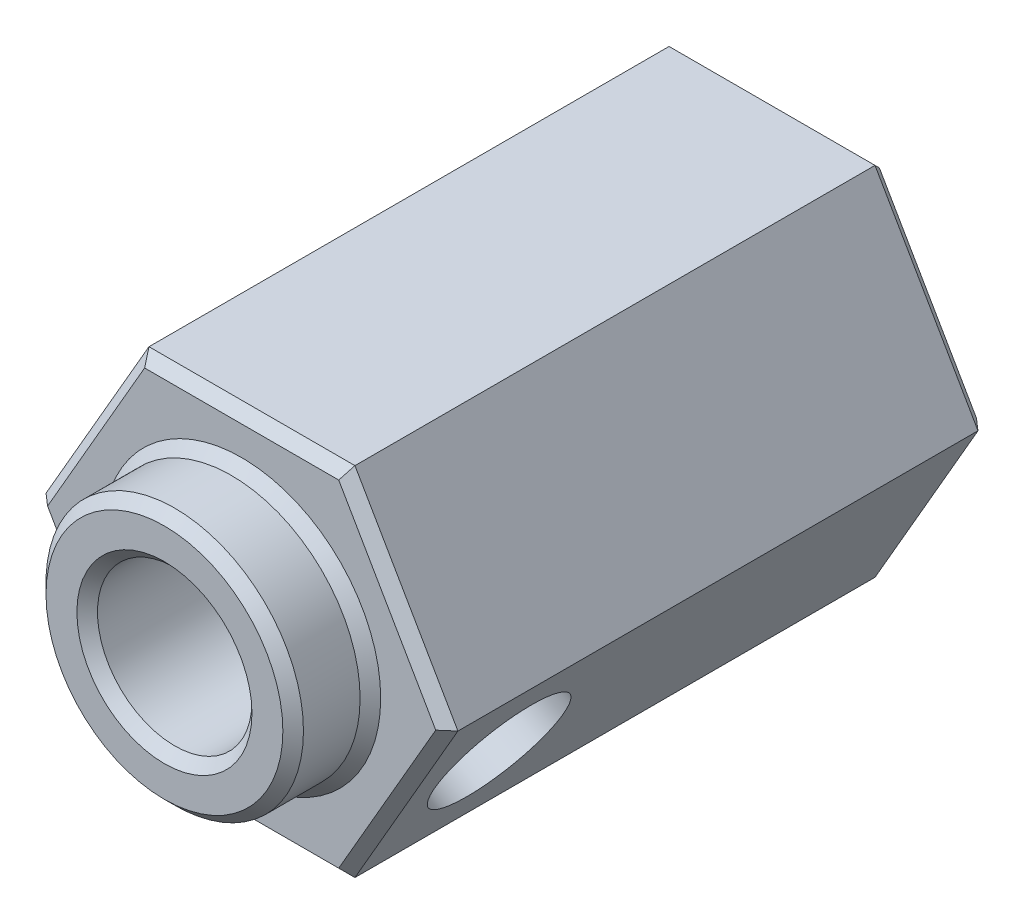
ISO-10303-21;
HEADER;
FILE_DESCRIPTION(('STEP AP214'),'2;1');
FILE_NAME('part.step','',(''),(''),'','','');
FILE_SCHEMA(('AUTOMOTIVE_DESIGN { 1 0 10303 214 1 1 1 1 }'));
ENDSEC;
DATA;
#1=APPLICATION_CONTEXT('core data for automotive mechanical design processes');
#2=APPLICATION_PROTOCOL_DEFINITION('international standard','automotive_design',2000,#1);
#3=PRODUCT_CONTEXT('',#1,'mechanical');
#4=PRODUCT('Part','Part','',(#3));
#5=PRODUCT_RELATED_PRODUCT_CATEGORY('part','',(#4));
#6=PRODUCT_DEFINITION_FORMATION('','',#4);
#7=PRODUCT_DEFINITION_CONTEXT('part definition',#1,'design');
#8=PRODUCT_DEFINITION('design','',#6,#7);
#9=PRODUCT_DEFINITION_SHAPE('','',#8);
#10=(LENGTH_UNIT() NAMED_UNIT(*) SI_UNIT(.MILLI.,.METRE.));
#11=(NAMED_UNIT(*) PLANE_ANGLE_UNIT() SI_UNIT($,.RADIAN.));
#12=(NAMED_UNIT(*) SI_UNIT($,.STERADIAN.) SOLID_ANGLE_UNIT());
#13=UNCERTAINTY_MEASURE_WITH_UNIT(LENGTH_MEASURE(1.E-05),#10,'distance_accuracy_value','');
#14=(GEOMETRIC_REPRESENTATION_CONTEXT(3) GLOBAL_UNCERTAINTY_ASSIGNED_CONTEXT((#13)) GLOBAL_UNIT_ASSIGNED_CONTEXT((#10,
#11,#12)) REPRESENTATION_CONTEXT('',''));
#15=CARTESIAN_POINT('',(0.,0.,0.));
#16=DIRECTION('',(0.,0.,1.));
#17=DIRECTION('',(1.,0.,0.));
#18=AXIS2_PLACEMENT_3D('',#15,#16,#17);
#19=CARTESIAN_POINT('',(-2.,3.46410161513776,12.));
#20=DIRECTION('',(0.866025403784439,-0.5,0.));
#21=DIRECTION('',(0.5,0.866025403784439,0.));
#22=AXIS2_PLACEMENT_3D('',#19,#20,#21);
#23=PLANE('',#22);
#24=DIRECTION('',(0.,0.,-1.));
#25=VECTOR('',#24,1.);
#26=CARTESIAN_POINT('',(-2.,3.46410161513776,12.));
#27=LINE('',#26,#25);
#28=CARTESIAN_POINT('',(-2.,3.46410161513776,10.3));
#29=VERTEX_POINT('',#28);
#30=CARTESIAN_POINT('',(-2.,3.46410161513776,0.199999999999999));
#31=VERTEX_POINT('',#30);
#32=EDGE_CURVE('E256',#29,#31,#27,.T.);
#33=ORIENTED_EDGE('',*,*,#32,.T.);
#34=DIRECTION('',(-0.5,-0.866025403784439,0.));
#35=VECTOR('',#34,1.);
#36=CARTESIAN_POINT('',(-2.,3.46410161513776,0.199999999999999));
#37=LINE('',#36,#35);
#38=CARTESIAN_POINT('',(-4.,0.,0.199999999999999));
#39=VERTEX_POINT('',#38);
#40=EDGE_CURVE('E151',#31,#39,#37,.T.);
#41=ORIENTED_EDGE('',*,*,#40,.T.);
#42=DIRECTION('',(0.,0.,-1.));
#43=VECTOR('',#42,1.);
#44=CARTESIAN_POINT('',(-4.,0.,12.));
#45=LINE('',#44,#43);
#46=CARTESIAN_POINT('',(-4.,0.,10.3));
#47=VERTEX_POINT('',#46);
#48=EDGE_CURVE('E135',#47,#39,#45,.T.);
#49=ORIENTED_EDGE('',*,*,#48,.F.);
#50=DIRECTION('',(0.5,0.866025403784439,0.));
#51=VECTOR('',#50,1.);
#52=CARTESIAN_POINT('',(-2.,3.46410161513776,10.3));
#53=LINE('',#52,#51);
#54=EDGE_CURVE('E148',#47,#29,#53,.T.);
#55=ORIENTED_EDGE('',*,*,#54,.T.);
#56=EDGE_LOOP('',(#33,#41,#49,#55));
#57=FACE_BOUND('',#56,.T.);
#58=ADVANCED_FACE('F39',(#57),#23,.F.);
#59=CARTESIAN_POINT('',(-4.,0.,12.));
#60=DIRECTION('',(0.866025403784438,0.5,0.));
#61=DIRECTION('',(-0.5,0.866025403784439,0.));
#62=AXIS2_PLACEMENT_3D('',#59,#60,#61);
#63=PLANE('',#62);
#64=ORIENTED_EDGE('',*,*,#48,.T.);
#65=DIRECTION('',(0.5,-0.866025403784439,0.));
#66=VECTOR('',#65,1.);
#67=CARTESIAN_POINT('',(-4.,0.,0.199999999999999));
#68=LINE('',#67,#66);
#69=CARTESIAN_POINT('',(-2.,-3.46410161513776,0.199999999999999));
#70=VERTEX_POINT('',#69);
#71=EDGE_CURVE('E143',#39,#70,#68,.T.);
#72=ORIENTED_EDGE('',*,*,#71,.T.);
#73=DIRECTION('',(0.,0.,-1.));
#74=VECTOR('',#73,1.);
#75=CARTESIAN_POINT('',(-2.,-3.46410161513776,12.));
#76=LINE('',#75,#74);
#77=CARTESIAN_POINT('',(-2.,-3.46410161513776,10.3));
#78=VERTEX_POINT('',#77);
#79=EDGE_CURVE('E138',#78,#70,#76,.T.);
#80=ORIENTED_EDGE('',*,*,#79,.F.);
#81=DIRECTION('',(-0.5,0.866025403784439,0.));
#82=VECTOR('',#81,1.);
#83=CARTESIAN_POINT('',(-4.,0.,10.3));
#84=LINE('',#83,#82);
#85=EDGE_CURVE('E131',#78,#47,#84,.T.);
#86=ORIENTED_EDGE('',*,*,#85,.T.);
#87=EDGE_LOOP('',(#64,#72,#80,#86));
#88=FACE_BOUND('',#87,.T.);
#89=ADVANCED_FACE('F133',(#88),#63,.F.);
#90=CARTESIAN_POINT('',(-2.,-3.46410161513776,12.));
#91=DIRECTION('',(0.,1.,0.));
#92=DIRECTION('',(-1.,0.,0.));
#93=AXIS2_PLACEMENT_3D('',#90,#91,#92);
#94=PLANE('',#93);
#95=ORIENTED_EDGE('',*,*,#79,.T.);
#96=DIRECTION('',(1.,0.,0.));
#97=VECTOR('',#96,1.);
#98=CARTESIAN_POINT('',(-2.,-3.46410161513776,0.199999999999999));
#99=LINE('',#98,#97);
#100=CARTESIAN_POINT('',(2.,-3.46410161513776,0.199999999999999));
#101=VERTEX_POINT('',#100);
#102=EDGE_CURVE('E233',#70,#101,#99,.T.);
#103=ORIENTED_EDGE('',*,*,#102,.T.);
#104=DIRECTION('',(0.,0.,-1.));
#105=VECTOR('',#104,1.);
#106=CARTESIAN_POINT('',(2.,-3.46410161513776,12.));
#107=LINE('',#106,#105);
#108=CARTESIAN_POINT('',(2.,-3.46410161513776,10.3));
#109=VERTEX_POINT('',#108);
#110=EDGE_CURVE('E266',#109,#101,#107,.T.);
#111=ORIENTED_EDGE('',*,*,#110,.F.);
#112=DIRECTION('',(-1.,0.,0.));
#113=VECTOR('',#112,1.);
#114=CARTESIAN_POINT('',(-2.,-3.46410161513776,10.3));
#115=LINE('',#114,#113);
#116=EDGE_CURVE('E230',#109,#78,#115,.T.);
#117=ORIENTED_EDGE('',*,*,#116,.T.);
#118=EDGE_LOOP('',(#95,#103,#111,#117));
#119=FACE_BOUND('',#118,.T.);
#120=ADVANCED_FACE('F311',(#119),#94,.F.);
#121=CARTESIAN_POINT('',(2.,-3.46410161513776,12.));
#122=DIRECTION('',(-0.866025403784439,0.5,0.));
#123=DIRECTION('',(-0.5,-0.866025403784439,0.));
#124=AXIS2_PLACEMENT_3D('',#121,#122,#123);
#125=PLANE('',#124);
#126=CARTESIAN_POINT('',(3.,-1.73205080756888,8.5));
#127=DIRECTION('',(0.866025403784439,-0.5,0.));
#128=DIRECTION('',(0.5,0.866025403784439,0.));
#129=AXIS2_PLACEMENT_3D('',#126,#127,#128);
#130=CIRCLE('',#129,1.24999999999999);
#131=CARTESIAN_POINT('',(3.625,-0.64951905283834,8.5));
#132=VERTEX_POINT('',#131);
#133=EDGE_CURVE('E215',#132,#132,#130,.T.);
#134=ORIENTED_EDGE('',*,*,#133,.F.);
#135=EDGE_LOOP('',(#134));
#136=FACE_BOUND('',#135,.T.);
#137=ORIENTED_EDGE('',*,*,#110,.T.);
#138=DIRECTION('',(0.5,0.866025403784439,0.));
#139=VECTOR('',#138,1.);
#140=CARTESIAN_POINT('',(2.,-3.46410161513776,0.199999999999999));
#141=LINE('',#140,#139);
#142=CARTESIAN_POINT('',(4.,0.,0.199999999999999));
#143=VERTEX_POINT('',#142);
#144=EDGE_CURVE('E243',#101,#143,#141,.T.);
#145=ORIENTED_EDGE('',*,*,#144,.T.);
#146=DIRECTION('',(0.,0.,-1.));
#147=VECTOR('',#146,1.);
#148=CARTESIAN_POINT('',(4.,0.,12.));
#149=LINE('',#148,#147);
#150=CARTESIAN_POINT('',(4.,0.,10.3));
#151=VERTEX_POINT('',#150);
#152=EDGE_CURVE('E264',#151,#143,#149,.T.);
#153=ORIENTED_EDGE('',*,*,#152,.F.);
#154=DIRECTION('',(-0.5,-0.866025403784439,0.));
#155=VECTOR('',#154,1.);
#156=CARTESIAN_POINT('',(2.,-3.46410161513776,10.3));
#157=LINE('',#156,#155);
#158=EDGE_CURVE('E225',#151,#109,#157,.T.);
#159=ORIENTED_EDGE('',*,*,#158,.T.);
#160=EDGE_LOOP('',(#137,#145,#153,#159));
#161=FACE_BOUND('',#160,.T.);
#162=ADVANCED_FACE('F382',(#136,#161),#125,.F.);
#163=CARTESIAN_POINT('',(4.,0.,12.));
#164=DIRECTION('',(-0.866025403784438,-0.5,0.));
#165=DIRECTION('',(0.5,-0.866025403784438,0.));
#166=AXIS2_PLACEMENT_3D('',#163,#164,#165);
#167=PLANE('',#166);
#168=ORIENTED_EDGE('',*,*,#152,.T.);
#169=DIRECTION('',(-0.5,0.866025403784438,0.));
#170=VECTOR('',#169,1.);
#171=CARTESIAN_POINT('',(4.,0.,0.199999999999999));
#172=LINE('',#171,#170);
#173=CARTESIAN_POINT('',(2.,3.46410161513776,0.199999999999999));
#174=VERTEX_POINT('',#173);
#175=EDGE_CURVE('E247',#143,#174,#172,.T.);
#176=ORIENTED_EDGE('',*,*,#175,.T.);
#177=DIRECTION('',(0.,0.,-1.));
#178=VECTOR('',#177,1.);
#179=CARTESIAN_POINT('',(2.,3.46410161513776,12.));
#180=LINE('',#179,#178);
#181=CARTESIAN_POINT('',(2.,3.46410161513776,10.3));
#182=VERTEX_POINT('',#181);
#183=EDGE_CURVE('E254',#182,#174,#180,.T.);
#184=ORIENTED_EDGE('',*,*,#183,.F.);
#185=DIRECTION('',(0.5,-0.866025403784438,0.));
#186=VECTOR('',#185,1.);
#187=CARTESIAN_POINT('',(4.,0.,10.3));
#188=LINE('',#187,#186);
#189=EDGE_CURVE('E245',#182,#151,#188,.T.);
#190=ORIENTED_EDGE('',*,*,#189,.T.);
#191=EDGE_LOOP('',(#168,#176,#184,#190));
#192=FACE_BOUND('',#191,.T.);
#193=ADVANCED_FACE('F260',(#192),#167,.F.);
#194=CARTESIAN_POINT('',(2.,3.46410161513776,12.));
#195=DIRECTION('',(0.,-1.,0.));
#196=DIRECTION('',(0.,0.,-1.));
#197=AXIS2_PLACEMENT_3D('',#194,#195,#196);
#198=PLANE('',#197);
#199=ORIENTED_EDGE('',*,*,#183,.T.);
#200=DIRECTION('',(-1.,0.,0.));
#201=VECTOR('',#200,1.);
#202=CARTESIAN_POINT('',(2.,3.46410161513776,0.199999999999999));
#203=LINE('',#202,#201);
#204=EDGE_CURVE('E166',#174,#31,#203,.T.);
#205=ORIENTED_EDGE('',*,*,#204,.T.);
#206=ORIENTED_EDGE('',*,*,#32,.F.);
#207=DIRECTION('',(1.,0.,0.));
#208=VECTOR('',#207,1.);
#209=CARTESIAN_POINT('',(2.,3.46410161513776,10.3));
#210=LINE('',#209,#208);
#211=EDGE_CURVE('E170',#29,#182,#210,.T.);
#212=ORIENTED_EDGE('',*,*,#211,.T.);
#213=EDGE_LOOP('',(#199,#205,#206,#212));
#214=FACE_BOUND('',#213,.T.);
#215=ADVANCED_FACE('F253',(#214),#198,.F.);
#216=CARTESIAN_POINT('',(0.,0.,0.));
#217=DIRECTION('',(0.,0.,1.));
#218=DIRECTION('',(1.,0.,0.));
#219=AXIS2_PLACEMENT_3D('',#216,#217,#218);
#220=PLANE('',#219);
#221=DIRECTION('',(-1.,0.,0.));
#222=VECTOR('',#221,1.);
#223=CARTESIAN_POINT('',(0.,-3.26410161513775,0.));
#224=LINE('',#223,#222);
#225=CARTESIAN_POINT('',(1.88452994616208,-3.26410161513775,0.));
#226=VERTEX_POINT('',#225);
#227=CARTESIAN_POINT('',(-1.88452994616207,-3.26410161513776,0.));
#228=VERTEX_POINT('',#227);
#229=EDGE_CURVE('E238',#226,#228,#224,.T.);
#230=ORIENTED_EDGE('',*,*,#229,.T.);
#231=DIRECTION('',(-0.5,0.866025403784438,0.));
#232=VECTOR('',#231,1.);
#233=CARTESIAN_POINT('',(-2.82679491924311,-1.63205080756888,0.));
#234=LINE('',#233,#232);
#235=CARTESIAN_POINT('',(-3.76905989232415,0.,0.));
#236=VERTEX_POINT('',#235);
#237=EDGE_CURVE('E234',#228,#236,#234,.T.);
#238=ORIENTED_EDGE('',*,*,#237,.T.);
#239=DIRECTION('',(0.5,0.866025403784439,0.));
#240=VECTOR('',#239,1.);
#241=CARTESIAN_POINT('',(-2.82679491924311,1.63205080756888,0.));
#242=LINE('',#241,#240);
#243=CARTESIAN_POINT('',(-1.88452994616208,3.26410161513775,0.));
#244=VERTEX_POINT('',#243);
#245=EDGE_CURVE('E402',#236,#244,#242,.T.);
#246=ORIENTED_EDGE('',*,*,#245,.T.);
#247=DIRECTION('',(1.,0.,0.));
#248=VECTOR('',#247,1.);
#249=CARTESIAN_POINT('',(0.,3.26410161513775,0.));
#250=LINE('',#249,#248);
#251=CARTESIAN_POINT('',(1.88452994616207,3.26410161513775,0.));
#252=VERTEX_POINT('',#251);
#253=EDGE_CURVE('E400',#244,#252,#250,.T.);
#254=ORIENTED_EDGE('',*,*,#253,.T.);
#255=DIRECTION('',(0.5,-0.866025403784438,0.));
#256=VECTOR('',#255,1.);
#257=CARTESIAN_POINT('',(2.82679491924311,1.63205080756888,0.));
#258=LINE('',#257,#256);
#259=CARTESIAN_POINT('',(3.76905989232415,0.,0.));
#260=VERTEX_POINT('',#259);
#261=EDGE_CURVE('E396',#252,#260,#258,.T.);
#262=ORIENTED_EDGE('',*,*,#261,.T.);
#263=DIRECTION('',(-0.5,-0.866025403784439,0.));
#264=VECTOR('',#263,1.);
#265=CARTESIAN_POINT('',(2.82679491924311,-1.63205080756888,0.));
#266=LINE('',#265,#264);
#267=EDGE_CURVE('E395',#260,#226,#266,.T.);
#268=ORIENTED_EDGE('',*,*,#267,.T.);
#269=EDGE_LOOP('',(#230,#238,#246,#254,#262,#268));
#270=FACE_BOUND('',#269,.T.);
#271=CARTESIAN_POINT('',(0.,0.,0.));
#272=DIRECTION('',(0.,0.,1.));
#273=DIRECTION('',(1.,0.,0.));
#274=AXIS2_PLACEMENT_3D('',#271,#272,#273);
#275=CIRCLE('',#274,1.45);
#276=CARTESIAN_POINT('',(-1.45,0.,0.));
#277=VERTEX_POINT('',#276);
#278=EDGE_CURVE('E404',#277,#277,#275,.T.);
#279=ORIENTED_EDGE('',*,*,#278,.T.);
#280=EDGE_LOOP('',(#279));
#281=FACE_BOUND('',#280,.T.);
#282=ADVANCED_FACE('F415',(#270,#281),#220,.F.);
#283=CARTESIAN_POINT('',(0.,0.,10.5));
#284=DIRECTION('',(0.,0.,1.));
#285=DIRECTION('',(1.,0.,0.));
#286=AXIS2_PLACEMENT_3D('',#283,#284,#285);
#287=PLANE('',#286);
#288=DIRECTION('',(-0.5,0.866025403784438,0.));
#289=VECTOR('',#288,1.);
#290=CARTESIAN_POINT('',(1.82679491924311,3.36410161513775,10.5));
#291=LINE('',#290,#289);
#292=CARTESIAN_POINT('',(3.76905989232415,0.,10.5));
#293=VERTEX_POINT('',#292);
#294=CARTESIAN_POINT('',(1.88452994616207,3.26410161513775,10.5));
#295=VERTEX_POINT('',#294);
#296=EDGE_CURVE('E56',#293,#295,#291,.T.);
#297=ORIENTED_EDGE('',*,*,#296,.T.);
#298=DIRECTION('',(-1.,0.,0.));
#299=VECTOR('',#298,1.);
#300=CARTESIAN_POINT('',(-2.,3.26410161513775,10.5));
#301=LINE('',#300,#299);
#302=CARTESIAN_POINT('',(-1.88452994616207,3.26410161513775,10.5));
#303=VERTEX_POINT('',#302);
#304=EDGE_CURVE('E186',#295,#303,#301,.T.);
#305=ORIENTED_EDGE('',*,*,#304,.T.);
#306=DIRECTION('',(-0.5,-0.866025403784439,0.));
#307=VECTOR('',#306,1.);
#308=CARTESIAN_POINT('',(-3.82679491924311,-0.100000000000002,10.5));
#309=LINE('',#308,#307);
#310=CARTESIAN_POINT('',(-3.76905989232415,0.,10.5));
#311=VERTEX_POINT('',#310);
#312=EDGE_CURVE('E179',#303,#311,#309,.T.);
#313=ORIENTED_EDGE('',*,*,#312,.T.);
#314=DIRECTION('',(0.5,-0.866025403784438,0.));
#315=VECTOR('',#314,1.);
#316=CARTESIAN_POINT('',(-1.82679491924311,-3.36410161513775,10.5));
#317=LINE('',#316,#315);
#318=CARTESIAN_POINT('',(-1.88452994616207,-3.26410161513775,10.5));
#319=VERTEX_POINT('',#318);
#320=EDGE_CURVE('E157',#311,#319,#317,.T.);
#321=ORIENTED_EDGE('',*,*,#320,.T.);
#322=DIRECTION('',(1.,0.,0.));
#323=VECTOR('',#322,1.);
#324=CARTESIAN_POINT('',(2.,-3.26410161513775,10.5));
#325=LINE('',#324,#323);
#326=CARTESIAN_POINT('',(1.88452994616207,-3.26410161513775,10.5));
#327=VERTEX_POINT('',#326);
#328=EDGE_CURVE('E182',#319,#327,#325,.T.);
#329=ORIENTED_EDGE('',*,*,#328,.T.);
#330=DIRECTION('',(0.5,0.866025403784439,0.));
#331=VECTOR('',#330,1.);
#332=CARTESIAN_POINT('',(3.82679491924311,0.100000000000002,10.5));
#333=LINE('',#332,#331);
#334=EDGE_CURVE('E61',#327,#293,#333,.T.);
#335=ORIENTED_EDGE('',*,*,#334,.T.);
#336=EDGE_LOOP('',(#297,#305,#313,#321,#329,#335));
#337=FACE_BOUND('',#336,.T.);
#338=CARTESIAN_POINT('',(0.,0.,10.5));
#339=DIRECTION('',(0.,0.,1.));
#340=DIRECTION('',(1.,0.,0.));
#341=AXIS2_PLACEMENT_3D('',#338,#339,#340);
#342=CIRCLE('',#341,2.7);
#343=CARTESIAN_POINT('',(2.7,0.,10.5));
#344=VERTEX_POINT('',#343);
#345=EDGE_CURVE('E176',#344,#344,#342,.F.);
#346=ORIENTED_EDGE('',*,*,#345,.T.);
#347=EDGE_LOOP('',(#346));
#348=FACE_BOUND('',#347,.T.);
#349=ADVANCED_FACE('F418',(#337,#348),#287,.T.);
#350=CARTESIAN_POINT('',(0.,0.,10.5));
#351=DIRECTION('',(0.,0.,1.));
#352=DIRECTION('',(1.,0.,0.));
#353=AXIS2_PLACEMENT_3D('',#350,#351,#352);
#354=CYLINDRICAL_SURFACE('',#353,2.5);
#355=CARTESIAN_POINT('',(0.,0.,10.7));
#356=DIRECTION('',(0.,0.,1.));
#357=DIRECTION('',(1.,0.,0.));
#358=AXIS2_PLACEMENT_3D('',#355,#356,#357);
#359=CIRCLE('',#358,2.5);
#360=CARTESIAN_POINT('',(2.5,0.,10.7));
#361=VERTEX_POINT('',#360);
#362=EDGE_CURVE('E191',#361,#361,#359,.T.);
#363=ORIENTED_EDGE('',*,*,#362,.T.);
#364=EDGE_LOOP('',(#363));
#365=FACE_BOUND('',#364,.T.);
#366=CARTESIAN_POINT('',(0.,0.,11.8));
#367=DIRECTION('',(0.,0.,1.));
#368=DIRECTION('',(1.,0.,0.));
#369=AXIS2_PLACEMENT_3D('',#366,#367,#368);
#370=CIRCLE('',#369,2.5);
#371=CARTESIAN_POINT('',(2.5,0.,11.8));
#372=VERTEX_POINT('',#371);
#373=EDGE_CURVE('E188',#372,#372,#370,.F.);
#374=ORIENTED_EDGE('',*,*,#373,.T.);
#375=EDGE_LOOP('',(#374));
#376=FACE_BOUND('',#375,.T.);
#377=ADVANCED_FACE('F421',(#365,#376),#354,.T.);
#378=CARTESIAN_POINT('',(0.,0.,12.));
#379=DIRECTION('',(0.,0.,1.));
#380=DIRECTION('',(1.,0.,0.));
#381=AXIS2_PLACEMENT_3D('',#378,#379,#380);
#382=PLANE('',#381);
#383=CARTESIAN_POINT('',(0.,0.,12.));
#384=DIRECTION('',(0.,0.,1.));
#385=DIRECTION('',(1.,0.,0.));
#386=AXIS2_PLACEMENT_3D('',#383,#384,#385);
#387=CIRCLE('',#386,1.7);
#388=CARTESIAN_POINT('',(1.7,0.,12.));
#389=VERTEX_POINT('',#388);
#390=EDGE_CURVE('E12',#389,#389,#387,.F.);
#391=ORIENTED_EDGE('',*,*,#390,.T.);
#392=EDGE_LOOP('',(#391));
#393=FACE_BOUND('',#392,.T.);
#394=CARTESIAN_POINT('',(0.,0.,12.));
#395=DIRECTION('',(0.,0.,1.));
#396=DIRECTION('',(1.,0.,0.));
#397=AXIS2_PLACEMENT_3D('',#394,#395,#396);
#398=CIRCLE('',#397,2.3);
#399=CARTESIAN_POINT('',(2.3,0.,12.));
#400=VERTEX_POINT('',#399);
#401=EDGE_CURVE('E48',#400,#400,#398,.T.);
#402=ORIENTED_EDGE('',*,*,#401,.T.);
#403=EDGE_LOOP('',(#402));
#404=FACE_BOUND('',#403,.T.);
#405=ADVANCED_FACE('F302',(#393,#404),#382,.T.);
#406=CARTESIAN_POINT('',(0.,0.,4.));
#407=DIRECTION('',(0.,0.,1.));
#408=DIRECTION('',(1.,0.,0.));
#409=AXIS2_PLACEMENT_3D('',#406,#407,#408);
#410=CYLINDRICAL_SURFACE('',#409,1.5);
#411=CARTESIAN_POINT('',(0.,0.,11.8));
#412=DIRECTION('',(0.,0.,1.));
#413=DIRECTION('',(1.,0.,0.));
#414=AXIS2_PLACEMENT_3D('',#411,#412,#413);
#415=CIRCLE('',#414,1.5);
#416=CARTESIAN_POINT('',(1.5,0.,11.8));
#417=VERTEX_POINT('',#416);
#418=EDGE_CURVE('E194',#417,#417,#415,.T.);
#419=ORIENTED_EDGE('',*,*,#418,.T.);
#420=EDGE_LOOP('',(#419));
#421=FACE_BOUND('',#420,.T.);
#422=CARTESIAN_POINT('',(1.5,0.,7.50000000000001));
#423=CARTESIAN_POINT('',(1.49999834870555,0.0731290957146582,7.54749545355936));
#424=CARTESIAN_POINT('',(1.49464150599603,0.142889537736776,7.60017474077853));
#425=CARTESIAN_POINT('',(1.47627725865759,0.273813805675676,7.7142847197748));
#426=CARTESIAN_POINT('',(1.46325631765288,0.334962183513343,7.77573074958901));
#427=CARTESIAN_POINT('',(1.43670553359997,0.433410668455124,7.89184528358647));
#428=CARTESIAN_POINT('',(1.4239862694601,0.472957989907081,7.94480649504319));
#429=CARTESIAN_POINT('',(1.39851418563679,0.543649729560264,8.05604280517781));
#430=CARTESIAN_POINT('',(1.38576157748451,0.574818731265313,8.11430167117265));
#431=CARTESIAN_POINT('',(1.36755570587546,0.61653787915355,8.21480683789351));
#432=CARTESIAN_POINT('',(1.36111510805411,0.630482343785444,8.25544239274009));
#433=CARTESIAN_POINT('',(1.35083948295688,0.652211027690329,8.3386172485145));
#434=CARTESIAN_POINT('',(1.34699817867424,0.660010094972041,8.38115169685546));
#435=CARTESIAN_POINT('',(1.34281921252366,0.668478700455008,8.46748682738123));
#436=CARTESIAN_POINT('',(1.34251019143851,0.66908995894938,8.51129497687214));
#437=CARTESIAN_POINT('',(1.34556073582981,0.662929065807041,8.59827397958993));
#438=CARTESIAN_POINT('',(1.34892472292679,0.656148015216937,8.641444001158));
#439=CARTESIAN_POINT('',(1.35951500923574,0.633951890314912,8.73522807297774));
#440=CARTESIAN_POINT('',(1.36743100070353,0.616958889165956,8.78537671842102));
#441=CARTESIAN_POINT('',(1.38532227365822,0.575664022069383,8.88220616431736));
#442=CARTESIAN_POINT('',(1.39530432515725,0.55133800475905,8.92887486007877));
#443=CARTESIAN_POINT('',(1.42135504956368,0.481472001810968,9.04480516843294));
#444=CARTESIAN_POINT('',(1.4376050109532,0.431799728201112,9.11152309627362));
#445=CARTESIAN_POINT('',(1.4660366564826,0.322431775661243,9.23716372357264));
#446=CARTESIAN_POINT('',(1.47821207828173,0.262720877589641,9.29607434046819));
#447=CARTESIAN_POINT('',(1.49553795771435,0.133277591308918,9.4073823019534));
#448=CARTESIAN_POINT('',(1.50046599278633,0.0632977045559425,9.45953030112621));
#449=CARTESIAN_POINT('',(1.49946779779379,-0.0832334924577511,9.55332712790811));
#450=CARTESIAN_POINT('',(1.49357628234232,-0.159763037185519,9.59500904838928));
#451=CARTESIAN_POINT('',(1.47241920257654,-0.291363432790726,9.65389067690136));
#452=CARTESIAN_POINT('',(1.46077398090493,-0.345427991535705,9.67465349620111));
#453=CARTESIAN_POINT('',(1.43076046640372,-0.45396462480659,9.70909955028768));
#454=CARTESIAN_POINT('',(1.4123973793821,-0.508436351878096,9.72278824718963));
#455=CARTESIAN_POINT('',(1.36875177420597,-0.616378945199837,9.74228061727669));
#456=CARTESIAN_POINT('',(1.34343349229842,-0.669843068907137,9.7480425849766));
#457=CARTESIAN_POINT('',(1.28650188501182,-0.773569523570908,9.75111394347554));
#458=CARTESIAN_POINT('',(1.25488952405765,-0.823832343499129,9.74842462830983));
#459=CARTESIAN_POINT('',(1.18934071674729,-0.915638812241669,9.73536055010953));
#460=CARTESIAN_POINT('',(1.15579797597835,-0.957558784587451,9.7256238193511));
#461=CARTESIAN_POINT('',(1.08557949540656,-1.03648911641613,9.69976534227391));
#462=CARTESIAN_POINT('',(1.04890328045353,-1.07349872912759,9.68364262625186));
#463=CARTESIAN_POINT('',(0.971225842722709,-1.14440316557988,9.64458545085491));
#464=CARTESIAN_POINT('',(0.930097702309297,-1.17795513117782,9.62128600544497));
#465=CARTESIAN_POINT('',(0.846890023227651,-1.23913291676991,9.56927086387831));
#466=CARTESIAN_POINT('',(0.80480983609276,-1.26675455437221,9.54055137185562));
#467=CARTESIAN_POINT('',(0.700788335821639,-1.32818443496698,9.46373045336684));
#468=CARTESIAN_POINT('',(0.638907649779896,-1.35869886478776,9.41290256902417));
#469=CARTESIAN_POINT('',(0.518318681617116,-1.40912107516978,9.30274913336795));
#470=CARTESIAN_POINT('',(0.459618150035521,-1.42900390547796,9.24340400379027));
#471=CARTESIAN_POINT('',(0.358975828326843,-1.45717211725506,9.12817548621161));
#472=CARTESIAN_POINT('',(0.315923139440708,-1.46690461250212,9.07360709790774));
#473=CARTESIAN_POINT('',(0.237322679204986,-1.48164064888304,8.95875040566939));
#474=CARTESIAN_POINT('',(0.201752208675031,-1.48665865799974,8.89848023041658));
#475=CARTESIAN_POINT('',(0.154114631079649,-1.49217861110395,8.79571066829056));
#476=CARTESIAN_POINT('',(0.1382394964501,-1.49366926681424,8.75505383565103));
#477=CARTESIAN_POINT('',(0.113057946701223,-1.49578713808357,8.67176057574589));
#478=CARTESIAN_POINT('',(0.103735478023499,-1.49641646744182,8.62912926115814));
#479=CARTESIAN_POINT('',(0.0930185948233336,-1.49712456793295,8.54244450773122));
#480=CARTESIAN_POINT('',(0.091694890154134,-1.49719843007658,8.49838183724878));
#481=CARTESIAN_POINT('',(0.0974232894699297,-1.49683468733822,8.41079394302021));
#482=CARTESIAN_POINT('',(0.104484122469892,-1.49639654942829,8.36726932713413));
#483=CARTESIAN_POINT('',(0.127863227867679,-1.49459273557332,8.27369355579623));
#484=CARTESIAN_POINT('',(0.145731058056667,-1.49306135393971,8.22404559924228));
#485=CARTESIAN_POINT('',(0.188812439364928,-1.48822706615065,8.12810558549421));
#486=CARTESIAN_POINT('',(0.214050268956378,-1.48491827405722,8.08182526182001));
#487=CARTESIAN_POINT('',(0.285652126540268,-1.47321508975549,7.96654265635653));
#488=CARTESIAN_POINT('',(0.335745356950882,-1.46297904668608,7.90005862509199));
#489=CARTESIAN_POINT('',(0.442690378982489,-1.43426756022147,7.77474490622093));
#490=CARTESIAN_POINT('',(0.499552763913554,-1.41577907459122,7.71592752591874));
#491=CARTESIAN_POINT('',(0.618782566063448,-1.36798295482665,7.60436066180897));
#492=CARTESIAN_POINT('',(0.68127139485725,-1.33832899752633,7.5518853159955));
#493=CARTESIAN_POINT('',(0.80676589703643,-1.26661729144921,7.4571187495378));
#494=CARTESIAN_POINT('',(0.869769427344233,-1.22459744525742,7.41479711603588));
#495=CARTESIAN_POINT('',(0.973569071415654,-1.14240339452091,7.35411078680999));
#496=CARTESIAN_POINT('',(1.0151746300233,-1.10572411180849,7.33238933504942));
#497=CARTESIAN_POINT('',(1.0955028424062,-1.02618597582058,7.29602916542032));
#498=CARTESIAN_POINT('',(1.13422766283715,-0.983331839495652,7.28138507802195));
#499=CARTESIAN_POINT('',(1.20745587752488,-0.891906351358682,7.26002911871533));
#500=CARTESIAN_POINT('',(1.24193424689869,-0.843304135356921,7.25336242289115));
#501=CARTESIAN_POINT('',(1.30497798275815,-0.742015421176296,7.24861725235599));
#502=CARTESIAN_POINT('',(1.33354477613108,-0.689329912818686,7.25053670265649));
#503=CARTESIAN_POINT('',(1.38166095583507,-0.58647707274371,7.26226453760215));
#504=CARTESIAN_POINT('',(1.40178002588397,-0.53649173419737,7.27136922231559));
#505=CARTESIAN_POINT('',(1.43617759133132,-0.436131812842922,7.29604762107314));
#506=CARTESIAN_POINT('',(1.45045476004573,-0.385757144262282,7.31162280293748));
#507=CARTESIAN_POINT('',(1.47525469865589,-0.277788182659299,7.35146497169448));
#508=CARTESIAN_POINT('',(1.48480028404864,-0.22034014907853,7.37672877833939));
#509=CARTESIAN_POINT('',(1.49717768018167,-0.108000293303137,7.43374497198698));
#510=CARTESIAN_POINT('',(1.50000119929107,-0.0531117098682115,7.46550532008018));
#511=CARTESIAN_POINT('',(1.5,0.,7.50000000000001));
#512=B_SPLINE_CURVE_WITH_KNOTS('',3,(#422,#423,#424,#425,#426,#427,#428,#429,#430,#431,#432,
#433,#434,#435,#436,#437,#438,#439,#440,#441,#442,#443,#444,#445,#446,#447,#448,#449,#450,#451,
#452,#453,#454,#455,#456,#457,#458,#459,#460,#461,#462,#463,#464,#465,#466,#467,#468,#469,#470,
#471,#472,#473,#474,#475,#476,#477,#478,#479,#480,#481,#482,#483,#484,#485,#486,#487,#488,#489,
#490,#491,#492,#493,#494,#495,#496,#497,#498,#499,#500,#501,#502,#503,#504,#505,#506,#507,#508,
#509,#510,#511),.UNSPECIFIED.,.T.,.F.,(4,2,2,2,2,2,2,2,2,2,2,2,2,2,2,2,2,2,2,2,2,2,2,2,2,2,2,2,
2,2,2,2,2,2,2,2,2,2,2,2,2,2,2,2,4),(0.,0.26134802046222,0.523159026348649,0.724563471893337,
0.925370344814754,1.0552636019648,1.18484205097699,1.3154704216016,1.44625621810301,
1.60596890329784,1.76621346006986,2.01913620045274,2.27244590261732,2.53337827050389,
2.79347489710047,2.96999738113429,3.14638336312549,3.32369387354618,3.50097723603242,
3.66394722649192,3.82694197321883,4.00019984075612,4.17357950073748,4.4293172549369,
4.6856525697027,4.89562863223179,5.10495818748026,5.23555237762849,5.36582549563598,
5.49724857551187,5.62880859800358,5.78628322453802,5.94428257619841,6.19457216290846,
6.44525871786476,6.70446454708027,6.96288401764995,7.14088489031755,7.31875050256231,
7.49761867425079,7.67644362173353,7.83964916529988,8.0028917519737,8.19246812144831,
8.38227821142373),.UNSPECIFIED.);
#513=CARTESIAN_POINT('',(1.5,0.,7.50000000000001));
#514=VERTEX_POINT('',#513);
#515=EDGE_CURVE('E275',#514,#514,#512,.T.);
#516=ORIENTED_EDGE('',*,*,#515,.T.);
#517=EDGE_LOOP('',(#516));
#518=FACE_BOUND('',#517,.T.);
#519=CARTESIAN_POINT('',(0.,0.,4.));
#520=DIRECTION('',(0.,0.,1.));
#521=DIRECTION('',(1.,0.,0.));
#522=AXIS2_PLACEMENT_3D('',#519,#520,#521);
#523=CIRCLE('',#522,1.5);
#524=CARTESIAN_POINT('',(1.5,0.,4.));
#525=VERTEX_POINT('',#524);
#526=EDGE_CURVE('E268',#525,#525,#523,.T.);
#527=ORIENTED_EDGE('',*,*,#526,.F.);
#528=EDGE_LOOP('',(#527));
#529=FACE_BOUND('',#528,.T.);
#530=ADVANCED_FACE('F283',(#421,#518,#529),#410,.F.);
#531=CARTESIAN_POINT('',(0.,0.,4.));
#532=DIRECTION('',(0.,0.,1.));
#533=DIRECTION('',(1.,0.,0.));
#534=AXIS2_PLACEMENT_3D('',#531,#532,#533);
#535=PLANE('',#534);
#536=CARTESIAN_POINT('',(0.,0.,4.));
#537=DIRECTION('',(0.,0.,1.));
#538=DIRECTION('',(1.,0.,0.));
#539=AXIS2_PLACEMENT_3D('',#536,#537,#538);
#540=CIRCLE('',#539,1.24999999999999);
#541=CARTESIAN_POINT('',(1.24999999999999,0.,4.));
#542=VERTEX_POINT('',#541);
#543=EDGE_CURVE('E281',#542,#542,#540,.T.);
#544=ORIENTED_EDGE('',*,*,#543,.F.);
#545=EDGE_LOOP('',(#544));
#546=FACE_BOUND('',#545,.T.);
#547=ORIENTED_EDGE('',*,*,#526,.T.);
#548=EDGE_LOOP('',(#547));
#549=FACE_BOUND('',#548,.T.);
#550=ADVANCED_FACE('F295',(#546,#549),#535,.T.);
#551=CARTESIAN_POINT('',(0.,0.,4.));
#552=DIRECTION('',(0.,0.,1.));
#553=DIRECTION('',(1.,0.,0.));
#554=AXIS2_PLACEMENT_3D('',#551,#552,#553);
#555=CYLINDRICAL_SURFACE('',#554,1.24999999999999);
#556=CARTESIAN_POINT('',(0.,0.,0.200000000000005));
#557=DIRECTION('',(0.,0.,1.));
#558=DIRECTION('',(1.,0.,0.));
#559=AXIS2_PLACEMENT_3D('',#556,#557,#558);
#560=CIRCLE('',#559,1.24999999999999);
#561=CARTESIAN_POINT('',(-1.24999999999999,0.,0.200000000000005));
#562=VERTEX_POINT('',#561);
#563=EDGE_CURVE('E168',#562,#562,#560,.F.);
#564=ORIENTED_EDGE('',*,*,#563,.T.);
#565=EDGE_LOOP('',(#564));
#566=FACE_BOUND('',#565,.T.);
#567=ORIENTED_EDGE('',*,*,#543,.T.);
#568=EDGE_LOOP('',(#567));
#569=FACE_BOUND('',#568,.T.);
#570=ADVANCED_FACE('F292',(#566,#569),#555,.F.);
#571=CARTESIAN_POINT('',(3.,-1.73205080756888,8.5));
#572=DIRECTION('',(0.866025403784439,-0.5,0.));
#573=DIRECTION('',(0.5,0.866025403784439,0.));
#574=AXIS2_PLACEMENT_3D('',#571,#572,#573);
#575=CYLINDRICAL_SURFACE('',#574,1.24999999999999);
#576=ORIENTED_EDGE('',*,*,#133,.T.);
#577=EDGE_LOOP('',(#576));
#578=FACE_BOUND('',#577,.T.);
#579=ORIENTED_EDGE('',*,*,#515,.F.);
#580=EDGE_LOOP('',(#579));
#581=FACE_BOUND('',#580,.T.);
#582=ADVANCED_FACE('F287',(#578,#581),#575,.F.);
#583=CARTESIAN_POINT('',(4.,0.,0.199999999999999));
#584=DIRECTION('',(-0.612372435695791,-0.353553390593272,0.707106781186551));
#585=DIRECTION('',(-0.5,0.866025403784438,0.));
#586=AXIS2_PLACEMENT_3D('',#583,#584,#585);
#587=PLANE('',#586);
#588=DIRECTION('',(-0.755928946018457,0.,-0.654653670707974));
#589=VECTOR('',#588,1.);
#590=CARTESIAN_POINT('',(4.,0.,0.199999999999999));
#591=LINE('',#590,#589);
#592=EDGE_CURVE('E209',#260,#143,#591,.F.);
#593=ORIENTED_EDGE('',*,*,#592,.F.);
#594=ORIENTED_EDGE('',*,*,#261,.F.);
#595=DIRECTION('',(-0.377964473009228,-0.65465367070798,-0.654653670707973));
#596=VECTOR('',#595,1.);
#597=CARTESIAN_POINT('',(2.,3.46410161513776,0.199999999999999));
#598=LINE('',#597,#596);
#599=EDGE_CURVE('E212',#174,#252,#598,.T.);
#600=ORIENTED_EDGE('',*,*,#599,.F.);
#601=ORIENTED_EDGE('',*,*,#175,.F.);
#602=EDGE_LOOP('',(#593,#594,#600,#601));
#603=FACE_BOUND('',#602,.T.);
#604=ADVANCED_FACE('F291',(#603),#587,.F.);
#605=CARTESIAN_POINT('',(2.,3.46410161513776,0.199999999999999));
#606=DIRECTION('',(0.,-0.707106781186544,0.707106781186551));
#607=DIRECTION('',(-1.,0.,0.));
#608=AXIS2_PLACEMENT_3D('',#605,#606,#607);
#609=PLANE('',#608);
#610=ORIENTED_EDGE('',*,*,#599,.T.);
#611=ORIENTED_EDGE('',*,*,#253,.F.);
#612=DIRECTION('',(0.377964473009228,-0.65465367070798,-0.654653670707973));
#613=VECTOR('',#612,1.);
#614=CARTESIAN_POINT('',(-2.,3.46410161513776,0.199999999999999));
#615=LINE('',#614,#613);
#616=EDGE_CURVE('E206',#31,#244,#615,.T.);
#617=ORIENTED_EDGE('',*,*,#616,.F.);
#618=ORIENTED_EDGE('',*,*,#204,.F.);
#619=EDGE_LOOP('',(#610,#611,#617,#618));
#620=FACE_BOUND('',#619,.T.);
#621=ADVANCED_FACE('F331',(#620),#609,.F.);
#622=CARTESIAN_POINT('',(2.,-3.46410161513776,0.199999999999999));
#623=DIRECTION('',(-0.612372435695792,0.353553390593272,0.707106781186551));
#624=DIRECTION('',(0.5,0.866025403784439,0.));
#625=AXIS2_PLACEMENT_3D('',#622,#623,#624);
#626=PLANE('',#625);
#627=ORIENTED_EDGE('',*,*,#592,.T.);
#628=ORIENTED_EDGE('',*,*,#144,.F.);
#629=DIRECTION('',(-0.377964473009228,0.65465367070798,-0.654653670707973));
#630=VECTOR('',#629,1.);
#631=CARTESIAN_POINT('',(2.,-3.46410161513776,0.199999999999999));
#632=LINE('',#631,#630);
#633=EDGE_CURVE('E203',#226,#101,#632,.F.);
#634=ORIENTED_EDGE('',*,*,#633,.F.);
#635=ORIENTED_EDGE('',*,*,#267,.F.);
#636=EDGE_LOOP('',(#627,#628,#634,#635));
#637=FACE_BOUND('',#636,.T.);
#638=ADVANCED_FACE('F327',(#637),#626,.F.);
#639=CARTESIAN_POINT('',(-2.,3.46410161513776,0.199999999999999));
#640=DIRECTION('',(0.612372435695792,-0.353553390593272,0.707106781186551));
#641=DIRECTION('',(-0.5,-0.866025403784439,0.));
#642=AXIS2_PLACEMENT_3D('',#639,#640,#641);
#643=PLANE('',#642);
#644=ORIENTED_EDGE('',*,*,#616,.T.);
#645=ORIENTED_EDGE('',*,*,#245,.F.);
#646=DIRECTION('',(-0.755928946018457,0.,0.654653670707974));
#647=VECTOR('',#646,1.);
#648=CARTESIAN_POINT('',(-2.85714285714286,0.,-0.789743318610783));
#649=LINE('',#648,#647);
#650=EDGE_CURVE('E201',#39,#236,#649,.F.);
#651=ORIENTED_EDGE('',*,*,#650,.F.);
#652=ORIENTED_EDGE('',*,*,#40,.F.);
#653=EDGE_LOOP('',(#644,#645,#651,#652));
#654=FACE_BOUND('',#653,.T.);
#655=ADVANCED_FACE('F323',(#654),#643,.F.);
#656=CARTESIAN_POINT('',(-2.,-3.46410161513776,0.199999999999999));
#657=DIRECTION('',(0.,0.707106781186544,0.707106781186551));
#658=DIRECTION('',(1.,0.,0.));
#659=AXIS2_PLACEMENT_3D('',#656,#657,#658);
#660=PLANE('',#659);
#661=ORIENTED_EDGE('',*,*,#633,.T.);
#662=ORIENTED_EDGE('',*,*,#102,.F.);
#663=DIRECTION('',(0.377964473009226,0.654653670707981,-0.654653670707974));
#664=VECTOR('',#663,1.);
#665=CARTESIAN_POINT('',(-2.,-3.46410161513776,0.199999999999999));
#666=LINE('',#665,#664);
#667=EDGE_CURVE('E199',#228,#70,#666,.F.);
#668=ORIENTED_EDGE('',*,*,#667,.F.);
#669=ORIENTED_EDGE('',*,*,#229,.F.);
#670=EDGE_LOOP('',(#661,#662,#668,#669));
#671=FACE_BOUND('',#670,.T.);
#672=ADVANCED_FACE('F319',(#671),#660,.F.);
#673=CARTESIAN_POINT('',(-4.,0.,0.199999999999999));
#674=DIRECTION('',(0.612372435695792,0.353553390593273,0.70710678118655));
#675=DIRECTION('',(0.5,-0.866025403784439,0.));
#676=AXIS2_PLACEMENT_3D('',#673,#674,#675);
#677=PLANE('',#676);
#678=ORIENTED_EDGE('',*,*,#650,.T.);
#679=ORIENTED_EDGE('',*,*,#237,.F.);
#680=ORIENTED_EDGE('',*,*,#667,.T.);
#681=ORIENTED_EDGE('',*,*,#71,.F.);
#682=EDGE_LOOP('',(#678,#679,#680,#681));
#683=FACE_BOUND('',#682,.T.);
#684=ADVANCED_FACE('F315',(#683),#677,.F.);
#685=CARTESIAN_POINT('',(0.,0.,0.));
#686=DIRECTION('',(0.,0.,-1.));
#687=DIRECTION('',(-1.,0.,0.));
#688=AXIS2_PLACEMENT_3D('',#685,#686,#687);
#689=CONICAL_SURFACE('',#688,1.45,0.785398163397454);
#690=CARTESIAN_POINT('',(-1.24999999999999,0.,0.200000000000005));
#691=CARTESIAN_POINT('',(-1.25208333333333,0.,0.197916666666671));
#692=CARTESIAN_POINT('',(-1.25416666666666,0.,0.195833333333338));
#693=CARTESIAN_POINT('',(-1.25833333333333,0.,0.191666666666671));
#694=CARTESIAN_POINT('',(-1.26041666666666,0.,0.189583333333338));
#695=CARTESIAN_POINT('',(-1.26458333333333,0.,0.185416666666671));
#696=CARTESIAN_POINT('',(-1.26666666666666,0.,0.183333333333338));
#697=CARTESIAN_POINT('',(-1.27083333333333,0.,0.179166666666671));
#698=CARTESIAN_POINT('',(-1.27291666666666,0.,0.177083333333338));
#699=CARTESIAN_POINT('',(-1.27708333333333,0.,0.172916666666671));
#700=CARTESIAN_POINT('',(-1.27916666666666,0.,0.170833333333337));
#701=CARTESIAN_POINT('',(-1.28333333333333,0.,0.166666666666671));
#702=CARTESIAN_POINT('',(-1.28541666666666,0.,0.164583333333337));
#703=CARTESIAN_POINT('',(-1.28958333333333,0.,0.160416666666671));
#704=CARTESIAN_POINT('',(-1.29166666666666,0.,0.158333333333337));
#705=CARTESIAN_POINT('',(-1.29583333333333,0.,0.15416666666667));
#706=CARTESIAN_POINT('',(-1.29791666666666,0.,0.152083333333337));
#707=CARTESIAN_POINT('',(-1.30208333333333,0.,0.14791666666667));
#708=CARTESIAN_POINT('',(-1.30416666666666,0.,0.145833333333337));
#709=CARTESIAN_POINT('',(-1.30833333333333,0.,0.14166666666667));
#710=CARTESIAN_POINT('',(-1.31041666666666,0.,0.139583333333337));
#711=CARTESIAN_POINT('',(-1.31458333333333,0.,0.13541666666667));
#712=CARTESIAN_POINT('',(-1.31666666666666,0.,0.133333333333337));
#713=CARTESIAN_POINT('',(-1.32083333333333,0.,0.12916666666667));
#714=CARTESIAN_POINT('',(-1.32291666666666,0.,0.127083333333336));
#715=CARTESIAN_POINT('',(-1.32708333333333,0.,0.12291666666667));
#716=CARTESIAN_POINT('',(-1.32916666666666,0.,0.120833333333336));
#717=CARTESIAN_POINT('',(-1.33333333333333,0.,0.116666666666669));
#718=CARTESIAN_POINT('',(-1.33541666666666,0.,0.114583333333336));
#719=CARTESIAN_POINT('',(-1.33958333333333,0.,0.110416666666669));
#720=CARTESIAN_POINT('',(-1.34166666666666,0.,0.108333333333336));
#721=CARTESIAN_POINT('',(-1.34583333333333,0.,0.104166666666669));
#722=CARTESIAN_POINT('',(-1.34791666666666,0.,0.102083333333336));
#723=CARTESIAN_POINT('',(-1.35208333333333,0.,0.097916666666669));
#724=CARTESIAN_POINT('',(-1.35416666666666,0.,0.0958333333333357));
#725=CARTESIAN_POINT('',(-1.35833333333333,0.,0.0916666666666689));
#726=CARTESIAN_POINT('',(-1.36041666666666,0.,0.0895833333333355));
#727=CARTESIAN_POINT('',(-1.36458333333333,0.,0.0854166666666687));
#728=CARTESIAN_POINT('',(-1.36666666666666,0.,0.0833333333333354));
#729=CARTESIAN_POINT('',(-1.37083333333333,0.,0.0791666666666686));
#730=CARTESIAN_POINT('',(-1.37291666666666,0.,0.0770833333333352));
#731=CARTESIAN_POINT('',(-1.37708333333333,0.,0.0729166666666684));
#732=CARTESIAN_POINT('',(-1.37916666666666,0.,0.0708333333333351));
#733=CARTESIAN_POINT('',(-1.38333333333333,0.,0.0666666666666683));
#734=CARTESIAN_POINT('',(-1.38541666666666,0.,0.0645833333333349));
#735=CARTESIAN_POINT('',(-1.38958333333333,0.,0.0604166666666681));
#736=CARTESIAN_POINT('',(-1.39166666666666,0.,0.0583333333333347));
#737=CARTESIAN_POINT('',(-1.39583333333333,0.,0.054166666666668));
#738=CARTESIAN_POINT('',(-1.39791666666666,0.,0.0520833333333346));
#739=CARTESIAN_POINT('',(-1.40208333333333,0.,0.0479166666666678));
#740=CARTESIAN_POINT('',(-1.40416666666666,0.,0.0458333333333344));
#741=CARTESIAN_POINT('',(-1.40833333333333,0.,0.0416666666666677));
#742=CARTESIAN_POINT('',(-1.41041666666667,0.,0.0395833333333343));
#743=CARTESIAN_POINT('',(-1.41458333333333,0.,0.0354166666666675));
#744=CARTESIAN_POINT('',(-1.41666666666667,0.,0.0333333333333341));
#745=CARTESIAN_POINT('',(-1.42083333333333,0.,0.0291666666666674));
#746=CARTESIAN_POINT('',(-1.42291666666667,0.,0.027083333333334));
#747=CARTESIAN_POINT('',(-1.42708333333333,0.,0.0229166666666672));
#748=CARTESIAN_POINT('',(-1.42916666666667,0.,0.0208333333333338));
#749=CARTESIAN_POINT('',(-1.43333333333333,0.,0.0166666666666671));
#750=CARTESIAN_POINT('',(-1.43541666666667,0.,0.0145833333333337));
#751=CARTESIAN_POINT('',(-1.43958333333333,0.,0.0104166666666669));
#752=CARTESIAN_POINT('',(-1.44166666666667,0.,0.00833333333333354));
#753=CARTESIAN_POINT('',(-1.44583333333333,0.,0.00416666666666676));
#754=CARTESIAN_POINT('',(-1.44791666666667,0.,0.00208333333333336));
#755=CARTESIAN_POINT('',(-1.45,0.,0.));
#756=B_SPLINE_CURVE_WITH_KNOTS('',3,(#690,#691,#692,#693,#694,#695,#696,#697,#698,#699,#700,
#701,#702,#703,#704,#705,#706,#707,#708,#709,#710,#711,#712,#713,#714,#715,#716,#717,#718,#719,
#720,#721,#722,#723,#724,#725,#726,#727,#728,#729,#730,#731,#732,#733,#734,#735,#736,#737,#738,
#739,#740,#741,#742,#743,#744,#745,#746,#747,#748,#749,#750,#751,#752,#753,#754,#755),
.UNSPECIFIED.,.F.,.F.,(4,2,2,2,2,2,2,2,2,2,2,2,2,2,2,2,2,2,2,2,2,2,2,2,2,2,2,2,2,2,2,2,4),(0.,
0.00883883476483208,0.0176776695296642,0.0265165042944964,0.0353553390593285,0.0441941738241605,
0.0530330085889926,0.0618718433538247,0.0707106781186569,0.079549512883489,0.0883883476483211,
0.0972271824131532,0.106066017177985,0.114904851942817,0.12374368670765,0.132582521472482,
0.141421356237314,0.150260191002146,0.159099025766978,0.16793786053181,0.176776695296642,
0.185615530061474,0.194454364826306,0.203293199591139,0.212132034355971,0.220970869120803,
0.229809703885635,0.238648538650467,0.247487373415299,0.256326208180131,0.265165042944963,
0.274003877709795,0.282842712474628),.UNSPECIFIED.);
#757=EDGE_CURVE('BSEAM318',#562,#277,#756,.T.);
#758=ORIENTED_EDGE('',*,*,#563,.F.);
#759=ORIENTED_EDGE('',*,*,#278,.F.);
#760=ORIENTED_EDGE('',*,*,#757,.T.);
#761=ORIENTED_EDGE('',*,*,#757,.F.);
#762=EDGE_LOOP('',(#758,#760,#759,#761));
#763=FACE_BOUND('',#762,.T.);
#764=ADVANCED_FACE('F318',(#763),#689,.F.);
#765=CARTESIAN_POINT('',(0.,-3.26410161513775,10.5));
#766=DIRECTION('',(0.,-0.707106781186547,0.707106781186547));
#767=DIRECTION('',(-1.,0.,0.));
#768=AXIS2_PLACEMENT_3D('',#765,#766,#767);
#769=PLANE('',#768);
#770=DIRECTION('',(0.377964473009228,0.654653670707977,0.654653670707977));
#771=VECTOR('',#770,1.);
#772=CARTESIAN_POINT('',(-1.61531138242463,-2.79780138440379,10.966300230734));
#773=LINE('',#772,#771);
#774=EDGE_CURVE('E219',#78,#319,#773,.T.);
#775=ORIENTED_EDGE('',*,*,#774,.F.);
#776=ORIENTED_EDGE('',*,*,#116,.F.);
#777=DIRECTION('',(-0.37796447300923,0.654653670707976,0.654653670707977));
#778=VECTOR('',#777,1.);
#779=CARTESIAN_POINT('',(1.61531138242463,-2.79780138440379,10.966300230734));
#780=LINE('',#779,#778);
#781=EDGE_CURVE('E43',#327,#109,#780,.F.);
#782=ORIENTED_EDGE('',*,*,#781,.F.);
#783=ORIENTED_EDGE('',*,*,#328,.F.);
#784=EDGE_LOOP('',(#775,#776,#782,#783));
#785=FACE_BOUND('',#784,.T.);
#786=ADVANCED_FACE('F229',(#785),#769,.T.);
#787=CARTESIAN_POINT('',(2.82679491924311,-1.63205080756888,10.5));
#788=DIRECTION('',(0.612372435695793,-0.353553390593273,0.707106781186549));
#789=DIRECTION('',(-0.5,-0.866025403784439,0.));
#790=AXIS2_PLACEMENT_3D('',#787,#788,#789);
#791=PLANE('',#790);
#792=ORIENTED_EDGE('',*,*,#781,.T.);
#793=ORIENTED_EDGE('',*,*,#158,.F.);
#794=DIRECTION('',(-0.755928946018456,0.,0.654653670707976));
#795=VECTOR('',#794,1.);
#796=CARTESIAN_POINT('',(3.23062276484927,0.,10.966300230734));
#797=LINE('',#796,#795);
#798=EDGE_CURVE('E160',#293,#151,#797,.F.);
#799=ORIENTED_EDGE('',*,*,#798,.F.);
#800=ORIENTED_EDGE('',*,*,#334,.F.);
#801=EDGE_LOOP('',(#792,#793,#799,#800));
#802=FACE_BOUND('',#801,.T.);
#803=ADVANCED_FACE('F224',(#802),#791,.T.);
#804=CARTESIAN_POINT('',(-2.82679491924311,-1.63205080756888,10.5));
#805=DIRECTION('',(-0.612372435695794,-0.353553390593274,0.707106781186548));
#806=DIRECTION('',(-0.5,0.866025403784439,0.));
#807=AXIS2_PLACEMENT_3D('',#804,#805,#806);
#808=PLANE('',#807);
#809=ORIENTED_EDGE('',*,*,#774,.T.);
#810=ORIENTED_EDGE('',*,*,#320,.F.);
#811=DIRECTION('',(0.755928946018455,0.,0.654653670707977));
#812=VECTOR('',#811,1.);
#813=CARTESIAN_POINT('',(-3.23062276484927,0.,10.966300230734));
#814=LINE('',#813,#812);
#815=EDGE_CURVE('E155',#47,#311,#814,.T.);
#816=ORIENTED_EDGE('',*,*,#815,.F.);
#817=ORIENTED_EDGE('',*,*,#85,.F.);
#818=EDGE_LOOP('',(#809,#810,#816,#817));
#819=FACE_BOUND('',#818,.T.);
#820=ADVANCED_FACE('F156',(#819),#808,.T.);
#821=CARTESIAN_POINT('',(2.82679491924311,1.63205080756888,10.5));
#822=DIRECTION('',(0.612372435695794,0.353553390593274,0.707106781186548));
#823=DIRECTION('',(0.5,-0.866025403784438,0.));
#824=AXIS2_PLACEMENT_3D('',#821,#822,#823);
#825=PLANE('',#824);
#826=ORIENTED_EDGE('',*,*,#798,.T.);
#827=ORIENTED_EDGE('',*,*,#189,.F.);
#828=DIRECTION('',(-0.377964473009229,-0.654653670707977,0.654653670707977));
#829=VECTOR('',#828,1.);
#830=CARTESIAN_POINT('',(1.61531138242463,2.79780138440379,10.966300230734));
#831=LINE('',#830,#829);
#832=EDGE_CURVE('E161',#295,#182,#831,.F.);
#833=ORIENTED_EDGE('',*,*,#832,.F.);
#834=ORIENTED_EDGE('',*,*,#296,.F.);
#835=EDGE_LOOP('',(#826,#827,#833,#834));
#836=FACE_BOUND('',#835,.T.);
#837=ADVANCED_FACE('F348',(#836),#825,.T.);
#838=CARTESIAN_POINT('',(-2.82679491924311,1.63205080756888,10.5));
#839=DIRECTION('',(-0.612372435695794,0.353553390593273,0.707106781186548));
#840=DIRECTION('',(0.5,0.866025403784439,0.));
#841=AXIS2_PLACEMENT_3D('',#838,#839,#840);
#842=PLANE('',#841);
#843=ORIENTED_EDGE('',*,*,#815,.T.);
#844=ORIENTED_EDGE('',*,*,#312,.F.);
#845=DIRECTION('',(-0.377964473009229,0.654653670707977,-0.654653670707977));
#846=VECTOR('',#845,1.);
#847=CARTESIAN_POINT('',(-1.61531138242464,2.79780138440379,10.966300230734));
#848=LINE('',#847,#846);
#849=EDGE_CURVE('E165',#29,#303,#848,.F.);
#850=ORIENTED_EDGE('',*,*,#849,.F.);
#851=ORIENTED_EDGE('',*,*,#54,.F.);
#852=EDGE_LOOP('',(#843,#844,#850,#851));
#853=FACE_BOUND('',#852,.T.);
#854=ADVANCED_FACE('F164',(#853),#842,.T.);
#855=CARTESIAN_POINT('',(0.,3.26410161513775,10.5));
#856=DIRECTION('',(0.,0.707106781186547,0.707106781186547));
#857=DIRECTION('',(1.,0.,0.));
#858=AXIS2_PLACEMENT_3D('',#855,#856,#857);
#859=PLANE('',#858);
#860=ORIENTED_EDGE('',*,*,#832,.T.);
#861=ORIENTED_EDGE('',*,*,#211,.F.);
#862=ORIENTED_EDGE('',*,*,#849,.T.);
#863=ORIENTED_EDGE('',*,*,#304,.F.);
#864=EDGE_LOOP('',(#860,#861,#862,#863));
#865=FACE_BOUND('',#864,.T.);
#866=ADVANCED_FACE('F342',(#865),#859,.T.);
#867=CARTESIAN_POINT('',(0.,0.,10.7));
#868=DIRECTION('',(0.,0.,-1.));
#869=DIRECTION('',(-1.,0.,0.));
#870=AXIS2_PLACEMENT_3D('',#867,#868,#869);
#871=CONICAL_SURFACE('',#870,2.5,0.785398163397445);
#872=ORIENTED_EDGE('',*,*,#345,.F.);
#873=EDGE_LOOP('',(#872));
#874=FACE_BOUND('',#873,.T.);
#875=ORIENTED_EDGE('',*,*,#362,.F.);
#876=EDGE_LOOP('',(#875));
#877=FACE_BOUND('',#876,.T.);
#878=ADVANCED_FACE('F345',(#874,#877),#871,.T.);
#879=CARTESIAN_POINT('',(0.,0.,11.8));
#880=DIRECTION('',(0.,0.,1.));
#881=DIRECTION('',(1.,0.,0.));
#882=AXIS2_PLACEMENT_3D('',#879,#880,#881);
#883=CONICAL_SURFACE('',#882,1.5,0.785398163397447);
#884=ORIENTED_EDGE('',*,*,#390,.F.);
#885=EDGE_LOOP('',(#884));
#886=FACE_BOUND('',#885,.T.);
#887=ORIENTED_EDGE('',*,*,#418,.F.);
#888=EDGE_LOOP('',(#887));
#889=FACE_BOUND('',#888,.T.);
#890=ADVANCED_FACE('F359',(#886,#889),#883,.F.);
#891=CARTESIAN_POINT('',(0.,0.,12.));
#892=DIRECTION('',(0.,0.,-1.));
#893=DIRECTION('',(-1.,0.,0.));
#894=AXIS2_PLACEMENT_3D('',#891,#892,#893);
#895=CONICAL_SURFACE('',#894,2.3,0.785398163397447);
#896=ORIENTED_EDGE('',*,*,#373,.F.);
#897=EDGE_LOOP('',(#896));
#898=FACE_BOUND('',#897,.T.);
#899=ORIENTED_EDGE('',*,*,#401,.F.);
#900=EDGE_LOOP('',(#899));
#901=FACE_BOUND('',#900,.T.);
#902=ADVANCED_FACE('F41',(#898,#901),#895,.T.);
#903=CLOSED_SHELL('',(#58,#89,#120,#162,#193,#215,#282,#349,#377,#405,#530,#550,#570,#582,#604,
#621,#638,#655,#672,#684,#764,#786,#803,#820,#837,#854,#866,#878,#890,#902));
#904=MANIFOLD_SOLID_BREP('B2',#903);
#905=ADVANCED_BREP_SHAPE_REPRESENTATION('',(#18,#904),#14);
#906=SHAPE_DEFINITION_REPRESENTATION(#9,#905);
ENDSEC;
END-ISO-10303-21;
